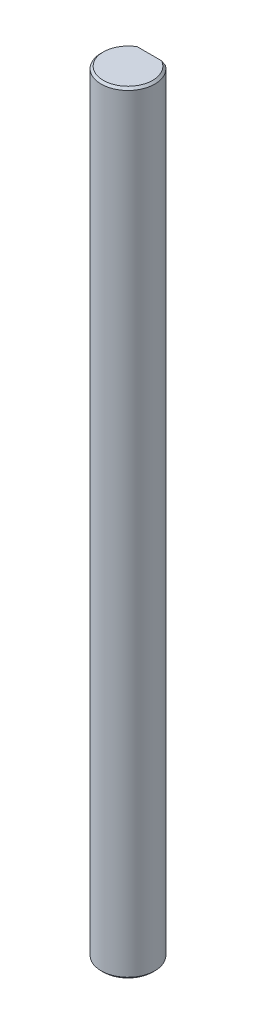
ISO-10303-21;
HEADER;
FILE_DESCRIPTION(('STEP AP214'),'2;1');
FILE_NAME('part.step','',(''),(''),'','','');
FILE_SCHEMA(('AUTOMOTIVE_DESIGN { 1 0 10303 214 1 1 1 1 }'));
ENDSEC;
DATA;
#1=APPLICATION_CONTEXT('core data for automotive mechanical design processes');
#2=APPLICATION_PROTOCOL_DEFINITION('international standard','automotive_design',2000,#1);
#3=PRODUCT_CONTEXT('',#1,'mechanical');
#4=PRODUCT('Part','Part','',(#3));
#5=PRODUCT_RELATED_PRODUCT_CATEGORY('part','',(#4));
#6=PRODUCT_DEFINITION_FORMATION('','',#4);
#7=PRODUCT_DEFINITION_CONTEXT('part definition',#1,'design');
#8=PRODUCT_DEFINITION('design','',#6,#7);
#9=PRODUCT_DEFINITION_SHAPE('','',#8);
#10=(LENGTH_UNIT() NAMED_UNIT(*) SI_UNIT(.MILLI.,.METRE.));
#11=(NAMED_UNIT(*) PLANE_ANGLE_UNIT() SI_UNIT($,.RADIAN.));
#12=(NAMED_UNIT(*) SI_UNIT($,.STERADIAN.) SOLID_ANGLE_UNIT());
#13=UNCERTAINTY_MEASURE_WITH_UNIT(LENGTH_MEASURE(1.E-05),#10,'distance_accuracy_value','');
#14=(GEOMETRIC_REPRESENTATION_CONTEXT(3) GLOBAL_UNCERTAINTY_ASSIGNED_CONTEXT((#13)) GLOBAL_UNIT_ASSIGNED_CONTEXT((#10,
#11,#12)) REPRESENTATION_CONTEXT('',''));
#15=CARTESIAN_POINT('',(0.,0.,0.));
#16=DIRECTION('',(0.,0.,1.));
#17=DIRECTION('',(1.,0.,0.));
#18=AXIS2_PLACEMENT_3D('',#15,#16,#17);
#19=CARTESIAN_POINT('',(0.,72.,0.));
#20=DIRECTION('',(0.,-1.,0.));
#21=DIRECTION('',(0.,0.,-1.));
#22=AXIS2_PLACEMENT_3D('',#19,#20,#21);
#23=CYLINDRICAL_SURFACE('',#22,2.5);
#24=CARTESIAN_POINT('',(0.,0.200000000000006,0.));
#25=DIRECTION('',(0.,1.,0.));
#26=DIRECTION('',(0.,0.,1.));
#27=AXIS2_PLACEMENT_3D('',#24,#25,#26);
#28=CIRCLE('',#27,2.5);
#29=CARTESIAN_POINT('',(0.,0.200000000000006,2.5));
#30=VERTEX_POINT('',#29);
#31=EDGE_CURVE('E110',#30,#30,#28,.T.);
#32=ORIENTED_EDGE('',*,*,#31,.T.);
#33=EDGE_LOOP('',(#32));
#34=FACE_BOUND('',#33,.T.);
#35=DIRECTION('',(0.,1.,0.));
#36=VECTOR('',#35,1.);
#37=CARTESIAN_POINT('',(1.5,62.,-2.));
#38=LINE('',#37,#36);
#39=CARTESIAN_POINT('',(1.5,62.,-2.));
#40=VERTEX_POINT('',#39);
#41=CARTESIAN_POINT('',(1.5,71.8,-2.));
#42=VERTEX_POINT('',#41);
#43=EDGE_CURVE('E98',#40,#42,#38,.T.);
#44=ORIENTED_EDGE('',*,*,#43,.T.);
#45=CARTESIAN_POINT('',(0.,71.8,0.));
#46=DIRECTION('',(0.,1.,0.));
#47=DIRECTION('',(0.,0.,1.));
#48=AXIS2_PLACEMENT_3D('',#45,#46,#47);
#49=CIRCLE('',#48,2.5);
#50=CARTESIAN_POINT('',(-1.5,71.8,-2.));
#51=VERTEX_POINT('',#50);
#52=EDGE_CURVE('E101',#42,#51,#49,.F.);
#53=ORIENTED_EDGE('',*,*,#52,.T.);
#54=DIRECTION('',(0.,1.,0.));
#55=VECTOR('',#54,1.);
#56=CARTESIAN_POINT('',(-1.5,62.,-2.));
#57=LINE('',#56,#55);
#58=CARTESIAN_POINT('',(-1.5,62.,-2.));
#59=VERTEX_POINT('',#58);
#60=EDGE_CURVE('E97',#59,#51,#57,.T.);
#61=ORIENTED_EDGE('',*,*,#60,.F.);
#62=CARTESIAN_POINT('',(0.,62.,0.));
#63=DIRECTION('',(0.,1.,0.));
#64=DIRECTION('',(0.,0.,1.));
#65=AXIS2_PLACEMENT_3D('',#62,#63,#64);
#66=CIRCLE('',#65,2.5);
#67=EDGE_CURVE('E86',#40,#59,#66,.T.);
#68=ORIENTED_EDGE('',*,*,#67,.F.);
#69=EDGE_LOOP('',(#44,#53,#61,#68));
#70=FACE_BOUND('',#69,.T.);
#71=ADVANCED_FACE('F43',(#34,#70),#23,.T.);
#72=CARTESIAN_POINT('',(0.,72.,0.));
#73=DIRECTION('',(0.,1.,0.));
#74=DIRECTION('',(0.,0.,1.));
#75=AXIS2_PLACEMENT_3D('',#72,#73,#74);
#76=PLANE('',#75);
#77=DIRECTION('',(1.,0.,0.));
#78=VECTOR('',#77,1.);
#79=CARTESIAN_POINT('',(-1.5,72.,-2.));
#80=LINE('',#79,#78);
#81=CARTESIAN_POINT('',(-1.13578166916005,72.,-2.));
#82=VERTEX_POINT('',#81);
#83=CARTESIAN_POINT('',(1.13578166916005,72.,-2.));
#84=VERTEX_POINT('',#83);
#85=EDGE_CURVE('E94',#82,#84,#80,.T.);
#86=ORIENTED_EDGE('',*,*,#85,.F.);
#87=CARTESIAN_POINT('',(0.,72.,0.));
#88=DIRECTION('',(0.,1.,0.));
#89=DIRECTION('',(0.,0.,1.));
#90=AXIS2_PLACEMENT_3D('',#87,#88,#89);
#91=CIRCLE('',#90,2.3);
#92=EDGE_CURVE('E118',#82,#84,#91,.T.);
#93=ORIENTED_EDGE('',*,*,#92,.T.);
#94=EDGE_LOOP('',(#86,#93));
#95=FACE_BOUND('',#94,.T.);
#96=ADVANCED_FACE('F130',(#95),#76,.T.);
#97=CARTESIAN_POINT('',(0.,0.,0.));
#98=DIRECTION('',(0.,1.,0.));
#99=DIRECTION('',(0.,0.,1.));
#100=AXIS2_PLACEMENT_3D('',#97,#98,#99);
#101=PLANE('',#100);
#102=CARTESIAN_POINT('',(0.,0.,0.));
#103=DIRECTION('',(0.,1.,0.));
#104=DIRECTION('',(0.,0.,1.));
#105=AXIS2_PLACEMENT_3D('',#102,#103,#104);
#106=CIRCLE('',#105,2.3);
#107=CARTESIAN_POINT('',(0.,0.,2.3));
#108=VERTEX_POINT('',#107);
#109=EDGE_CURVE('E114',#108,#108,#106,.F.);
#110=ORIENTED_EDGE('',*,*,#109,.T.);
#111=EDGE_LOOP('',(#110));
#112=FACE_BOUND('',#111,.T.);
#113=ADVANCED_FACE('F129',(#112),#101,.F.);
#114=CARTESIAN_POINT('',(-1.5,62.,-2.));
#115=DIRECTION('',(0.,0.,1.));
#116=DIRECTION('',(1.,0.,0.));
#117=AXIS2_PLACEMENT_3D('',#114,#115,#116);
#118=PLANE('',#117);
#119=ORIENTED_EDGE('',*,*,#85,.T.);
#120=CARTESIAN_POINT('',(1.13578166916005,72.,-2.));
#121=CARTESIAN_POINT('',(1.16684531148885,71.9846588897814,-2.));
#122=CARTESIAN_POINT('',(1.19771947914307,71.9689381376528,-2.));
#123=CARTESIAN_POINT('',(1.2590958235893,71.9368162971825,-2.));
#124=CARTESIAN_POINT('',(1.28959814953928,71.920415494086,-2.));
#125=CARTESIAN_POINT('',(1.35026188212941,71.8870005487157,-2.));
#126=CARTESIAN_POINT('',(1.380423307277,71.8699864399503,-2.));
#127=CARTESIAN_POINT('',(1.4404397134517,71.8353973160196,-2.));
#128=CARTESIAN_POINT('',(1.47029456200405,71.8178220708339,-2.));
#129=CARTESIAN_POINT('',(1.5,71.8,-2.));
#130=B_SPLINE_CURVE_WITH_KNOTS('',3,(#120,#121,#122,#123,#124,#125,#126,#127,#128,#129),
.UNSPECIFIED.,.F.,.F.,(4,2,2,2,4),(0.,0.103930863284106,0.207818565532299,0.311700600383641,
0.415625779466402),.UNSPECIFIED.);
#131=EDGE_CURVE('E11',#84,#42,#130,.T.);
#132=ORIENTED_EDGE('',*,*,#131,.T.);
#133=ORIENTED_EDGE('',*,*,#43,.F.);
#134=DIRECTION('',(1.,0.,0.));
#135=VECTOR('',#134,1.);
#136=CARTESIAN_POINT('',(-1.5,62.,-2.));
#137=LINE('',#136,#135);
#138=EDGE_CURVE('E89',#59,#40,#137,.T.);
#139=ORIENTED_EDGE('',*,*,#138,.F.);
#140=ORIENTED_EDGE('',*,*,#60,.T.);
#141=CARTESIAN_POINT('',(-1.5,71.8,-2.));
#142=CARTESIAN_POINT('',(-1.47029456200406,71.8178220708339,-2.));
#143=CARTESIAN_POINT('',(-1.4404397134517,71.8353973160196,-2.));
#144=CARTESIAN_POINT('',(-1.380423307277,71.8699864399503,-2.));
#145=CARTESIAN_POINT('',(-1.35026188212941,71.8870005487157,-2.));
#146=CARTESIAN_POINT('',(-1.28959814953928,71.920415494086,-2.));
#147=CARTESIAN_POINT('',(-1.2590958235893,71.9368162971825,-2.));
#148=CARTESIAN_POINT('',(-1.19771947914307,71.9689381376528,-2.));
#149=CARTESIAN_POINT('',(-1.16684531148885,71.9846588897814,-2.));
#150=CARTESIAN_POINT('',(-1.13578166916005,72.,-2.));
#151=B_SPLINE_CURVE_WITH_KNOTS('',3,(#141,#142,#143,#144,#145,#146,#147,#148,#149,#150),
.UNSPECIFIED.,.F.,.F.,(4,2,2,2,4),(0.,0.103925179082762,0.207807213934104,0.311694916182298,
0.415625779466404),.UNSPECIFIED.);
#152=EDGE_CURVE('E59',#51,#82,#151,.T.);
#153=ORIENTED_EDGE('',*,*,#152,.T.);
#154=EDGE_LOOP('',(#119,#132,#133,#139,#140,#153));
#155=FACE_BOUND('',#154,.T.);
#156=ADVANCED_FACE('F96',(#155),#118,.F.);
#157=CARTESIAN_POINT('',(0.,62.,0.));
#158=DIRECTION('',(0.,1.,0.));
#159=DIRECTION('',(0.,0.,1.));
#160=AXIS2_PLACEMENT_3D('',#157,#158,#159);
#161=PLANE('',#160);
#162=ORIENTED_EDGE('',*,*,#67,.T.);
#163=ORIENTED_EDGE('',*,*,#138,.T.);
#164=EDGE_LOOP('',(#162,#163));
#165=FACE_BOUND('',#164,.T.);
#166=ADVANCED_FACE('F88',(#165),#161,.T.);
#167=CARTESIAN_POINT('',(0.,0.200000000000006,0.));
#168=DIRECTION('',(0.,1.,0.));
#169=DIRECTION('',(0.,0.,1.));
#170=AXIS2_PLACEMENT_3D('',#167,#168,#169);
#171=CONICAL_SURFACE('',#170,2.5,0.785398163397443);
#172=ORIENTED_EDGE('',*,*,#109,.F.);
#173=EDGE_LOOP('',(#172));
#174=FACE_BOUND('',#173,.T.);
#175=ORIENTED_EDGE('',*,*,#31,.F.);
#176=EDGE_LOOP('',(#175));
#177=FACE_BOUND('',#176,.T.);
#178=ADVANCED_FACE('F141',(#174,#177),#171,.T.);
#179=CARTESIAN_POINT('',(0.,72.,0.));
#180=DIRECTION('',(0.,-1.,0.));
#181=DIRECTION('',(0.,0.,-1.));
#182=AXIS2_PLACEMENT_3D('',#179,#180,#181);
#183=CONICAL_SURFACE('',#182,2.3,0.785398163397478);
#184=ORIENTED_EDGE('',*,*,#152,.F.);
#185=ORIENTED_EDGE('',*,*,#52,.F.);
#186=ORIENTED_EDGE('',*,*,#131,.F.);
#187=ORIENTED_EDGE('',*,*,#92,.F.);
#188=EDGE_LOOP('',(#184,#185,#186,#187));
#189=FACE_BOUND('',#188,.T.);
#190=ADVANCED_FACE('F46',(#189),#183,.T.);
#191=CLOSED_SHELL('',(#71,#96,#113,#156,#166,#178,#190));
#192=MANIFOLD_SOLID_BREP('B2',#191);
#193=ADVANCED_BREP_SHAPE_REPRESENTATION('',(#18,#192),#14);
#194=SHAPE_DEFINITION_REPRESENTATION(#9,#193);
ENDSEC;
END-ISO-10303-21;
